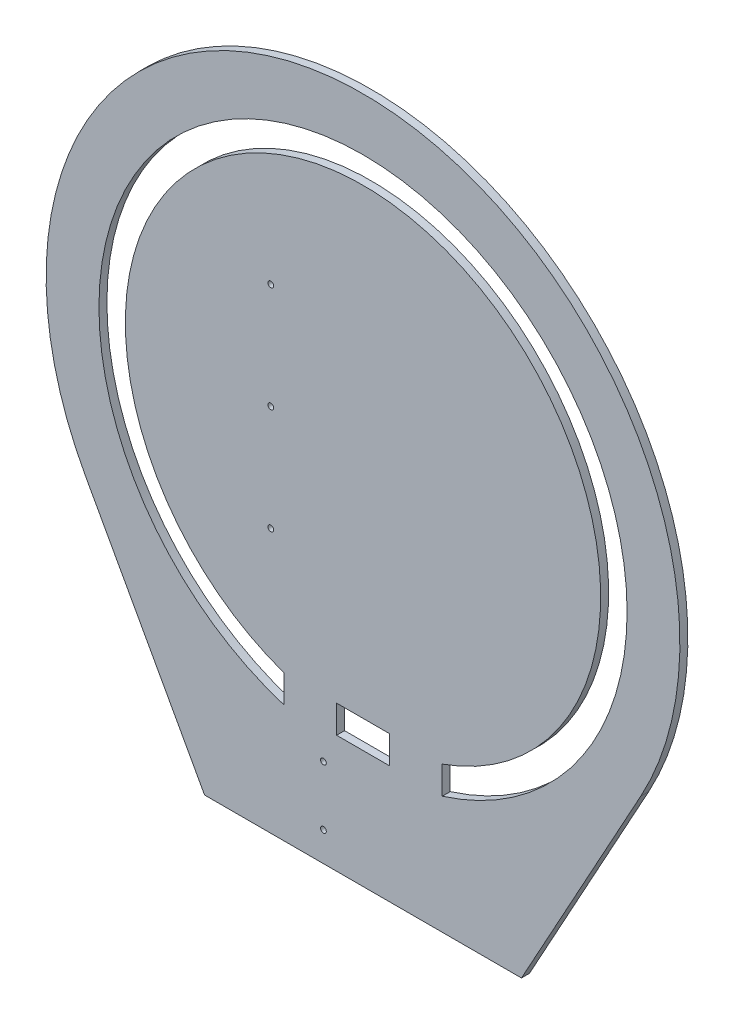
ISO-10303-21;
HEADER;
FILE_DESCRIPTION(('STEP AP214'),'2;1');
FILE_NAME('part.step','',(''),(''),'','','');
FILE_SCHEMA(('AUTOMOTIVE_DESIGN { 1 0 10303 214 1 1 1 1 }'));
ENDSEC;
DATA;
#1=APPLICATION_CONTEXT('core data for automotive mechanical design processes');
#2=APPLICATION_PROTOCOL_DEFINITION('international standard','automotive_design',2000,#1);
#3=PRODUCT_CONTEXT('',#1,'mechanical');
#4=PRODUCT('Part','Part','',(#3));
#5=PRODUCT_RELATED_PRODUCT_CATEGORY('part','',(#4));
#6=PRODUCT_DEFINITION_FORMATION('','',#4);
#7=PRODUCT_DEFINITION_CONTEXT('part definition',#1,'design');
#8=PRODUCT_DEFINITION('design','',#6,#7);
#9=PRODUCT_DEFINITION_SHAPE('','',#8);
#10=(LENGTH_UNIT() NAMED_UNIT(*) SI_UNIT(.MILLI.,.METRE.));
#11=(NAMED_UNIT(*) PLANE_ANGLE_UNIT() SI_UNIT($,.RADIAN.));
#12=(NAMED_UNIT(*) SI_UNIT($,.STERADIAN.) SOLID_ANGLE_UNIT());
#13=UNCERTAINTY_MEASURE_WITH_UNIT(LENGTH_MEASURE(1.E-05),#10,'distance_accuracy_value','');
#14=(GEOMETRIC_REPRESENTATION_CONTEXT(3) GLOBAL_UNCERTAINTY_ASSIGNED_CONTEXT((#13)) GLOBAL_UNIT_ASSIGNED_CONTEXT((#10,
#11,#12)) REPRESENTATION_CONTEXT('',''));
#15=CARTESIAN_POINT('',(0.,0.,0.));
#16=DIRECTION('',(0.,0.,1.));
#17=DIRECTION('',(1.,0.,0.));
#18=AXIS2_PLACEMENT_3D('',#15,#16,#17);
#19=CARTESIAN_POINT('',(26.2928846476366,-14.4459065795843,0.75438));
#20=DIRECTION('',(-0.876429488254551,0.481530219319478,0.));
#21=DIRECTION('',(-0.481530219319478,-0.876429488254552,0.));
#22=AXIS2_PLACEMENT_3D('',#19,#20,#21);
#23=PLANE('',#22);
#24=DIRECTION('',(0.481530219319478,0.876429488254552,0.));
#25=VECTOR('',#24,1.);
#26=CARTESIAN_POINT('',(26.2928846476366,-14.4459065795843,0.));
#27=LINE('',#26,#25);
#28=CARTESIAN_POINT('',(15.,-35.,0.));
#29=VERTEX_POINT('',#28);
#30=CARTESIAN_POINT('',(26.2928846476366,-14.4459065795843,0.));
#31=VERTEX_POINT('',#30);
#32=EDGE_CURVE('E219',#29,#31,#27,.T.);
#33=ORIENTED_EDGE('',*,*,#32,.T.);
#34=DIRECTION('',(0.,0.,-1.));
#35=VECTOR('',#34,1.);
#36=CARTESIAN_POINT('',(26.2928846476366,-14.4459065795843,0.75438));
#37=LINE('',#36,#35);
#38=CARTESIAN_POINT('',(26.2928846476366,-14.4459065795843,0.75438));
#39=VERTEX_POINT('',#38);
#40=EDGE_CURVE('E11',#39,#31,#37,.T.);
#41=ORIENTED_EDGE('',*,*,#40,.F.);
#42=DIRECTION('',(0.481530219319478,0.876429488254552,0.));
#43=VECTOR('',#42,1.);
#44=CARTESIAN_POINT('',(26.2928846476366,-14.4459065795843,0.75438));
#45=LINE('',#44,#43);
#46=CARTESIAN_POINT('',(15.,-35.,0.75438));
#47=VERTEX_POINT('',#46);
#48=EDGE_CURVE('E147',#47,#39,#45,.T.);
#49=ORIENTED_EDGE('',*,*,#48,.F.);
#50=DIRECTION('',(0.,0.,-1.));
#51=VECTOR('',#50,1.);
#52=CARTESIAN_POINT('',(15.,-35.,0.75438));
#53=LINE('',#52,#51);
#54=EDGE_CURVE('E231',#47,#29,#53,.T.);
#55=ORIENTED_EDGE('',*,*,#54,.T.);
#56=EDGE_LOOP('',(#33,#41,#49,#55));
#57=FACE_BOUND('',#56,.T.);
#58=ADVANCED_FACE('F45',(#57),#23,.F.);
#59=CARTESIAN_POINT('',(0.,0.,0.75438));
#60=DIRECTION('',(0.,0.,-1.));
#61=DIRECTION('',(-1.,0.,0.));
#62=AXIS2_PLACEMENT_3D('',#59,#60,#61);
#63=CYLINDRICAL_SURFACE('',#62,30.);
#64=CARTESIAN_POINT('',(0.,0.,0.));
#65=DIRECTION('',(0.,0.,1.));
#66=DIRECTION('',(1.,0.,0.));
#67=AXIS2_PLACEMENT_3D('',#64,#65,#66);
#68=CIRCLE('',#67,30.);
#69=CARTESIAN_POINT('',(-26.2928846476366,-14.4459065795843,0.));
#70=VERTEX_POINT('',#69);
#71=EDGE_CURVE('E154',#31,#70,#68,.T.);
#72=ORIENTED_EDGE('',*,*,#71,.T.);
#73=DIRECTION('',(0.,0.,-1.));
#74=VECTOR('',#73,1.);
#75=CARTESIAN_POINT('',(-26.2928846476366,-14.4459065795843,0.75438));
#76=LINE('',#75,#74);
#77=CARTESIAN_POINT('',(-26.2928846476366,-14.4459065795843,0.75438));
#78=VERTEX_POINT('',#77);
#79=EDGE_CURVE('E56',#78,#70,#76,.T.);
#80=ORIENTED_EDGE('',*,*,#79,.F.);
#81=CARTESIAN_POINT('',(0.,0.,0.75438));
#82=DIRECTION('',(0.,0.,1.));
#83=DIRECTION('',(1.,0.,0.));
#84=AXIS2_PLACEMENT_3D('',#81,#82,#83);
#85=CIRCLE('',#84,30.);
#86=EDGE_CURVE('E141',#39,#78,#85,.T.);
#87=ORIENTED_EDGE('',*,*,#86,.F.);
#88=ORIENTED_EDGE('',*,*,#40,.T.);
#89=EDGE_LOOP('',(#72,#80,#87,#88));
#90=FACE_BOUND('',#89,.T.);
#91=ADVANCED_FACE('F153',(#90),#63,.T.);
#92=CARTESIAN_POINT('',(-26.2928846476366,-14.4459065795843,0.75438));
#93=DIRECTION('',(-0.876429488254552,-0.481530219319478,0.));
#94=DIRECTION('',(0.481530219319478,-0.876429488254552,0.));
#95=AXIS2_PLACEMENT_3D('',#92,#93,#94);
#96=PLANE('',#95);
#97=DIRECTION('',(-0.481530219319478,0.876429488254552,0.));
#98=VECTOR('',#97,1.);
#99=CARTESIAN_POINT('',(-26.2928846476366,-14.4459065795843,0.));
#100=LINE('',#99,#98);
#101=CARTESIAN_POINT('',(-15.,-35.,0.));
#102=VERTEX_POINT('',#101);
#103=EDGE_CURVE('E225',#102,#70,#100,.T.);
#104=ORIENTED_EDGE('',*,*,#103,.F.);
#105=DIRECTION('',(0.,0.,-1.));
#106=VECTOR('',#105,1.);
#107=CARTESIAN_POINT('',(-15.,-35.,0.75438));
#108=LINE('',#107,#106);
#109=CARTESIAN_POINT('',(-15.,-35.,0.75438));
#110=VERTEX_POINT('',#109);
#111=EDGE_CURVE('E105',#110,#102,#108,.T.);
#112=ORIENTED_EDGE('',*,*,#111,.F.);
#113=DIRECTION('',(-0.481530219319478,0.876429488254552,0.));
#114=VECTOR('',#113,1.);
#115=CARTESIAN_POINT('',(-26.2928846476366,-14.4459065795843,0.75438));
#116=LINE('',#115,#114);
#117=EDGE_CURVE('E145',#110,#78,#116,.T.);
#118=ORIENTED_EDGE('',*,*,#117,.T.);
#119=ORIENTED_EDGE('',*,*,#79,.T.);
#120=EDGE_LOOP('',(#104,#112,#118,#119));
#121=FACE_BOUND('',#120,.T.);
#122=ADVANCED_FACE('F160',(#121),#96,.T.);
#123=CARTESIAN_POINT('',(2.5,0.,0.75438));
#124=DIRECTION('',(-1.,0.,0.));
#125=DIRECTION('',(0.,0.,1.));
#126=AXIS2_PLACEMENT_3D('',#123,#124,#125);
#127=PLANE('',#126);
#128=DIRECTION('',(0.,1.,0.));
#129=VECTOR('',#128,1.);
#130=CARTESIAN_POINT('',(2.5,0.,0.));
#131=LINE('',#130,#129);
#132=CARTESIAN_POINT('',(2.5,-23.8484800354236,0.));
#133=VERTEX_POINT('',#132);
#134=CARTESIAN_POINT('',(2.5,-21.2132034355964,0.));
#135=VERTEX_POINT('',#134);
#136=EDGE_CURVE('E203',#133,#135,#131,.T.);
#137=ORIENTED_EDGE('',*,*,#136,.F.);
#138=DIRECTION('',(0.,0.,-1.));
#139=VECTOR('',#138,1.);
#140=CARTESIAN_POINT('',(2.5,-23.8484800354236,0.75438));
#141=LINE('',#140,#139);
#142=CARTESIAN_POINT('',(2.5,-23.8484800354236,0.75438));
#143=VERTEX_POINT('',#142);
#144=EDGE_CURVE('E234',#143,#133,#141,.T.);
#145=ORIENTED_EDGE('',*,*,#144,.F.);
#146=DIRECTION('',(0.,1.,0.));
#147=VECTOR('',#146,1.);
#148=CARTESIAN_POINT('',(2.5,0.,0.75438));
#149=LINE('',#148,#147);
#150=CARTESIAN_POINT('',(2.5,-21.2132034355964,0.75438));
#151=VERTEX_POINT('',#150);
#152=EDGE_CURVE('E304',#143,#151,#149,.T.);
#153=ORIENTED_EDGE('',*,*,#152,.T.);
#154=DIRECTION('',(0.,0.,-1.));
#155=VECTOR('',#154,1.);
#156=CARTESIAN_POINT('',(2.5,-21.2132034355964,0.75438));
#157=LINE('',#156,#155);
#158=EDGE_CURVE('E237',#151,#135,#157,.T.);
#159=ORIENTED_EDGE('',*,*,#158,.T.);
#160=EDGE_LOOP('',(#137,#145,#153,#159));
#161=FACE_BOUND('',#160,.T.);
#162=ADVANCED_FACE('F336',(#161),#127,.T.);
#163=CARTESIAN_POINT('',(0.,-23.8484800354236,0.75438));
#164=DIRECTION('',(0.,1.,0.));
#165=DIRECTION('',(0.,0.,1.));
#166=AXIS2_PLACEMENT_3D('',#163,#164,#165);
#167=PLANE('',#166);
#168=DIRECTION('',(1.,0.,0.));
#169=VECTOR('',#168,1.);
#170=CARTESIAN_POINT('',(0.,-23.8484800354236,0.));
#171=LINE('',#170,#169);
#172=CARTESIAN_POINT('',(-2.5,-23.8484800354236,0.));
#173=VERTEX_POINT('',#172);
#174=EDGE_CURVE('E207',#173,#133,#171,.T.);
#175=ORIENTED_EDGE('',*,*,#174,.F.);
#176=DIRECTION('',(0.,0.,-1.));
#177=VECTOR('',#176,1.);
#178=CARTESIAN_POINT('',(-2.5,-23.8484800354236,0.75438));
#179=LINE('',#178,#177);
#180=CARTESIAN_POINT('',(-2.5,-23.8484800354236,0.75438));
#181=VERTEX_POINT('',#180);
#182=EDGE_CURVE('E243',#181,#173,#179,.T.);
#183=ORIENTED_EDGE('',*,*,#182,.F.);
#184=DIRECTION('',(1.,0.,0.));
#185=VECTOR('',#184,1.);
#186=CARTESIAN_POINT('',(0.,-23.8484800354236,0.75438));
#187=LINE('',#186,#185);
#188=EDGE_CURVE('E308',#181,#143,#187,.T.);
#189=ORIENTED_EDGE('',*,*,#188,.T.);
#190=ORIENTED_EDGE('',*,*,#144,.T.);
#191=EDGE_LOOP('',(#175,#183,#189,#190));
#192=FACE_BOUND('',#191,.T.);
#193=ADVANCED_FACE('F338',(#192),#167,.T.);
#194=CARTESIAN_POINT('',(-2.5,0.,0.75438));
#195=DIRECTION('',(-1.,0.,0.));
#196=DIRECTION('',(0.,0.,1.));
#197=AXIS2_PLACEMENT_3D('',#194,#195,#196);
#198=PLANE('',#197);
#199=DIRECTION('',(0.,1.,0.));
#200=VECTOR('',#199,1.);
#201=CARTESIAN_POINT('',(-2.5,0.,0.));
#202=LINE('',#201,#200);
#203=CARTESIAN_POINT('',(-2.5,-21.2132034355964,0.));
#204=VERTEX_POINT('',#203);
#205=EDGE_CURVE('E211',#173,#204,#202,.T.);
#206=ORIENTED_EDGE('',*,*,#205,.T.);
#207=DIRECTION('',(0.,0.,-1.));
#208=VECTOR('',#207,1.);
#209=CARTESIAN_POINT('',(-2.5,-21.2132034355964,0.75438));
#210=LINE('',#209,#208);
#211=CARTESIAN_POINT('',(-2.5,-21.2132034355964,0.75438));
#212=VERTEX_POINT('',#211);
#213=EDGE_CURVE('E240',#212,#204,#210,.T.);
#214=ORIENTED_EDGE('',*,*,#213,.F.);
#215=DIRECTION('',(0.,1.,0.));
#216=VECTOR('',#215,1.);
#217=CARTESIAN_POINT('',(-2.5,0.,0.75438));
#218=LINE('',#217,#216);
#219=EDGE_CURVE('E312',#181,#212,#218,.T.);
#220=ORIENTED_EDGE('',*,*,#219,.F.);
#221=ORIENTED_EDGE('',*,*,#182,.T.);
#222=EDGE_LOOP('',(#206,#214,#220,#221));
#223=FACE_BOUND('',#222,.T.);
#224=ADVANCED_FACE('F329',(#223),#198,.F.);
#225=CARTESIAN_POINT('',(-7.5,0.,0.75438));
#226=DIRECTION('',(-1.,0.,0.));
#227=DIRECTION('',(0.,0.,1.));
#228=AXIS2_PLACEMENT_3D('',#225,#226,#227);
#229=PLANE('',#228);
#230=DIRECTION('',(0.,1.,0.));
#231=VECTOR('',#230,1.);
#232=CARTESIAN_POINT('',(-7.5,0.,0.));
#233=LINE('',#232,#231);
#234=CARTESIAN_POINT('',(-7.5,-23.8484800354236,0.));
#235=VERTEX_POINT('',#234);
#236=CARTESIAN_POINT('',(-7.5,-21.2132034355964,0.));
#237=VERTEX_POINT('',#236);
#238=EDGE_CURVE('E168',#235,#237,#233,.T.);
#239=ORIENTED_EDGE('',*,*,#238,.F.);
#240=DIRECTION('',(0.,0.,-1.));
#241=VECTOR('',#240,1.);
#242=CARTESIAN_POINT('',(-7.5,-23.8484800354236,0.75438));
#243=LINE('',#242,#241);
#244=CARTESIAN_POINT('',(-7.5,-23.8484800354236,0.75438));
#245=VERTEX_POINT('',#244);
#246=EDGE_CURVE('E49',#245,#235,#243,.T.);
#247=ORIENTED_EDGE('',*,*,#246,.F.);
#248=DIRECTION('',(0.,1.,0.));
#249=VECTOR('',#248,1.);
#250=CARTESIAN_POINT('',(-7.5,0.,0.75438));
#251=LINE('',#250,#249);
#252=CARTESIAN_POINT('',(-7.5,-21.2132034355964,0.75438));
#253=VERTEX_POINT('',#252);
#254=EDGE_CURVE('E230',#245,#253,#251,.T.);
#255=ORIENTED_EDGE('',*,*,#254,.T.);
#256=DIRECTION('',(0.,0.,-1.));
#257=VECTOR('',#256,1.);
#258=CARTESIAN_POINT('',(-7.5,-21.2132034355964,0.75438));
#259=LINE('',#258,#257);
#260=EDGE_CURVE('E164',#253,#237,#259,.T.);
#261=ORIENTED_EDGE('',*,*,#260,.T.);
#262=EDGE_LOOP('',(#239,#247,#255,#261));
#263=FACE_BOUND('',#262,.T.);
#264=ADVANCED_FACE('F47',(#263),#229,.T.);
#265=CARTESIAN_POINT('',(0.,0.,0.75438));
#266=DIRECTION('',(0.,0.,-1.));
#267=DIRECTION('',(-1.,0.,0.));
#268=AXIS2_PLACEMENT_3D('',#265,#266,#267);
#269=CYLINDRICAL_SURFACE('',#268,25.);
#270=CARTESIAN_POINT('',(0.,0.,0.));
#271=DIRECTION('',(0.,0.,1.));
#272=DIRECTION('',(1.,0.,0.));
#273=AXIS2_PLACEMENT_3D('',#270,#271,#272);
#274=CIRCLE('',#273,25.);
#275=CARTESIAN_POINT('',(7.5,-23.8484800354236,0.));
#276=VERTEX_POINT('',#275);
#277=EDGE_CURVE('E172',#276,#235,#274,.T.);
#278=ORIENTED_EDGE('',*,*,#277,.F.);
#279=DIRECTION('',(0.,0.,-1.));
#280=VECTOR('',#279,1.);
#281=CARTESIAN_POINT('',(7.5,-23.8484800354236,0.75438));
#282=LINE('',#281,#280);
#283=CARTESIAN_POINT('',(7.5,-23.8484800354236,0.75438));
#284=VERTEX_POINT('',#283);
#285=EDGE_CURVE('E253',#284,#276,#282,.T.);
#286=ORIENTED_EDGE('',*,*,#285,.F.);
#287=CARTESIAN_POINT('',(0.,0.,0.75438));
#288=DIRECTION('',(0.,0.,1.));
#289=DIRECTION('',(1.,0.,0.));
#290=AXIS2_PLACEMENT_3D('',#287,#288,#289);
#291=CIRCLE('',#290,25.);
#292=EDGE_CURVE('E264',#284,#245,#291,.T.);
#293=ORIENTED_EDGE('',*,*,#292,.T.);
#294=ORIENTED_EDGE('',*,*,#246,.T.);
#295=EDGE_LOOP('',(#278,#286,#293,#294));
#296=FACE_BOUND('',#295,.T.);
#297=ADVANCED_FACE('F262',(#296),#269,.F.);
#298=CARTESIAN_POINT('',(7.5,0.,0.75438));
#299=DIRECTION('',(-1.,0.,0.));
#300=DIRECTION('',(0.,0.,1.));
#301=AXIS2_PLACEMENT_3D('',#298,#299,#300);
#302=PLANE('',#301);
#303=DIRECTION('',(0.,1.,0.));
#304=VECTOR('',#303,1.);
#305=CARTESIAN_POINT('',(7.5,0.,0.));
#306=LINE('',#305,#304);
#307=CARTESIAN_POINT('',(7.5,-21.2132034355964,0.));
#308=VERTEX_POINT('',#307);
#309=EDGE_CURVE('E176',#276,#308,#306,.T.);
#310=ORIENTED_EDGE('',*,*,#309,.T.);
#311=DIRECTION('',(0.,0.,-1.));
#312=VECTOR('',#311,1.);
#313=CARTESIAN_POINT('',(7.5,-21.2132034355964,0.75438));
#314=LINE('',#313,#312);
#315=CARTESIAN_POINT('',(7.5,-21.2132034355964,0.75438));
#316=VERTEX_POINT('',#315);
#317=EDGE_CURVE('E250',#316,#308,#314,.T.);
#318=ORIENTED_EDGE('',*,*,#317,.F.);
#319=DIRECTION('',(0.,1.,0.));
#320=VECTOR('',#319,1.);
#321=CARTESIAN_POINT('',(7.5,0.,0.75438));
#322=LINE('',#321,#320);
#323=EDGE_CURVE('E279',#284,#316,#322,.T.);
#324=ORIENTED_EDGE('',*,*,#323,.F.);
#325=ORIENTED_EDGE('',*,*,#285,.T.);
#326=EDGE_LOOP('',(#310,#318,#324,#325));
#327=FACE_BOUND('',#326,.T.);
#328=ADVANCED_FACE('F271',(#327),#302,.F.);
#329=CARTESIAN_POINT('',(0.,-21.2132034355964,0.75438));
#330=DIRECTION('',(0.,-1.,0.));
#331=DIRECTION('',(0.,0.,-1.));
#332=AXIS2_PLACEMENT_3D('',#329,#330,#331);
#333=PLANE('',#332);
#334=DIRECTION('',(-1.,0.,0.));
#335=VECTOR('',#334,1.);
#336=CARTESIAN_POINT('',(0.,-21.2132034355964,0.));
#337=LINE('',#336,#335);
#338=EDGE_CURVE('E215',#135,#204,#337,.T.);
#339=ORIENTED_EDGE('',*,*,#338,.F.);
#340=ORIENTED_EDGE('',*,*,#158,.F.);
#341=DIRECTION('',(-1.,0.,0.));
#342=VECTOR('',#341,1.);
#343=CARTESIAN_POINT('',(0.,-21.2132034355964,0.75438));
#344=LINE('',#343,#342);
#345=EDGE_CURVE('E315',#151,#212,#344,.T.);
#346=ORIENTED_EDGE('',*,*,#345,.T.);
#347=ORIENTED_EDGE('',*,*,#213,.T.);
#348=EDGE_LOOP('',(#339,#340,#346,#347));
#349=FACE_BOUND('',#348,.T.);
#350=ADVANCED_FACE('F322',(#349),#333,.T.);
#351=CARTESIAN_POINT('',(-3.7500000022113,-26.6242400340328,0.75438));
#352=DIRECTION('',(0.,0.,-1.));
#353=DIRECTION('',(-1.,0.,0.));
#354=AXIS2_PLACEMENT_3D('',#351,#352,#353);
#355=CYLINDRICAL_SURFACE('',#354,0.271779999999999);
#356=CARTESIAN_POINT('',(-3.7500000022113,-26.6242400340328,0.75438));
#357=DIRECTION('',(0.,0.,1.));
#358=DIRECTION('',(1.,0.,0.));
#359=AXIS2_PLACEMENT_3D('',#356,#357,#358);
#360=CIRCLE('',#359,0.271779999999999);
#361=CARTESIAN_POINT('',(-3.4782200022113,-26.6242400340328,0.75438));
#362=VERTEX_POINT('',#361);
#363=EDGE_CURVE('E300',#362,#362,#360,.T.);
#364=ORIENTED_EDGE('',*,*,#363,.T.);
#365=EDGE_LOOP('',(#364));
#366=FACE_BOUND('',#365,.T.);
#367=CARTESIAN_POINT('',(-3.7500000022113,-26.6242400340328,0.));
#368=DIRECTION('',(0.,0.,1.));
#369=DIRECTION('',(1.,0.,0.));
#370=AXIS2_PLACEMENT_3D('',#367,#368,#369);
#371=CIRCLE('',#370,0.271779999999999);
#372=CARTESIAN_POINT('',(-3.4782200022113,-26.6242400340328,0.));
#373=VERTEX_POINT('',#372);
#374=EDGE_CURVE('E199',#373,#373,#371,.T.);
#375=ORIENTED_EDGE('',*,*,#374,.F.);
#376=EDGE_LOOP('',(#375));
#377=FACE_BOUND('',#376,.T.);
#378=ADVANCED_FACE('F357',(#366,#377),#355,.F.);
#379=CARTESIAN_POINT('',(-3.7500000022113,-32.2242400340328,0.75438));
#380=DIRECTION('',(0.,0.,-1.));
#381=DIRECTION('',(-1.,0.,0.));
#382=AXIS2_PLACEMENT_3D('',#379,#380,#381);
#383=CYLINDRICAL_SURFACE('',#382,0.271780000000001);
#384=CARTESIAN_POINT('',(-3.7500000022113,-32.2242400340328,0.75438));
#385=DIRECTION('',(0.,0.,1.));
#386=DIRECTION('',(1.,0.,0.));
#387=AXIS2_PLACEMENT_3D('',#384,#385,#386);
#388=CIRCLE('',#387,0.271780000000001);
#389=CARTESIAN_POINT('',(-3.4782200022113,-32.2242400340328,0.75438));
#390=VERTEX_POINT('',#389);
#391=EDGE_CURVE('E296',#390,#390,#388,.T.);
#392=ORIENTED_EDGE('',*,*,#391,.T.);
#393=EDGE_LOOP('',(#392));
#394=FACE_BOUND('',#393,.T.);
#395=CARTESIAN_POINT('',(-3.7500000022113,-32.2242400340328,0.));
#396=DIRECTION('',(0.,0.,1.));
#397=DIRECTION('',(1.,0.,0.));
#398=AXIS2_PLACEMENT_3D('',#395,#396,#397);
#399=CIRCLE('',#398,0.271780000000001);
#400=CARTESIAN_POINT('',(-3.4782200022113,-32.2242400340328,0.));
#401=VERTEX_POINT('',#400);
#402=EDGE_CURVE('E195',#401,#401,#399,.T.);
#403=ORIENTED_EDGE('',*,*,#402,.F.);
#404=EDGE_LOOP('',(#403));
#405=FACE_BOUND('',#404,.T.);
#406=ADVANCED_FACE('F362',(#394,#405),#383,.F.);
#407=CARTESIAN_POINT('',(-8.73379214847929,-10.,0.75438));
#408=DIRECTION('',(0.,0.,-1.));
#409=DIRECTION('',(-1.,0.,0.));
#410=AXIS2_PLACEMENT_3D('',#407,#408,#409);
#411=CYLINDRICAL_SURFACE('',#410,0.271780000000002);
#412=CARTESIAN_POINT('',(-8.73379214847929,-10.,0.75438));
#413=DIRECTION('',(0.,0.,1.));
#414=DIRECTION('',(1.,0.,0.));
#415=AXIS2_PLACEMENT_3D('',#412,#413,#414);
#416=CIRCLE('',#415,0.271780000000002);
#417=CARTESIAN_POINT('',(-8.46201214847929,-10.,0.75438));
#418=VERTEX_POINT('',#417);
#419=EDGE_CURVE('E292',#418,#418,#416,.T.);
#420=ORIENTED_EDGE('',*,*,#419,.T.);
#421=EDGE_LOOP('',(#420));
#422=FACE_BOUND('',#421,.T.);
#423=CARTESIAN_POINT('',(-8.73379214847929,-10.,0.));
#424=DIRECTION('',(0.,0.,1.));
#425=DIRECTION('',(1.,0.,0.));
#426=AXIS2_PLACEMENT_3D('',#423,#424,#425);
#427=CIRCLE('',#426,0.271780000000002);
#428=CARTESIAN_POINT('',(-8.46201214847929,-10.,0.));
#429=VERTEX_POINT('',#428);
#430=EDGE_CURVE('E191',#429,#429,#427,.T.);
#431=ORIENTED_EDGE('',*,*,#430,.F.);
#432=EDGE_LOOP('',(#431));
#433=FACE_BOUND('',#432,.T.);
#434=ADVANCED_FACE('F380',(#422,#433),#411,.F.);
#435=CARTESIAN_POINT('',(-8.73379214847929,0.,0.75438));
#436=DIRECTION('',(0.,0.,-1.));
#437=DIRECTION('',(-1.,0.,0.));
#438=AXIS2_PLACEMENT_3D('',#435,#436,#437);
#439=CYLINDRICAL_SURFACE('',#438,0.271779999999998);
#440=CARTESIAN_POINT('',(-8.73379214847929,0.,0.75438));
#441=DIRECTION('',(0.,0.,1.));
#442=DIRECTION('',(1.,0.,0.));
#443=AXIS2_PLACEMENT_3D('',#440,#441,#442);
#444=CIRCLE('',#443,0.271779999999998);
#445=CARTESIAN_POINT('',(-8.46201214847929,0.,0.75438));
#446=VERTEX_POINT('',#445);
#447=EDGE_CURVE('E284',#446,#446,#444,.T.);
#448=ORIENTED_EDGE('',*,*,#447,.T.);
#449=EDGE_LOOP('',(#448));
#450=FACE_BOUND('',#449,.T.);
#451=CARTESIAN_POINT('',(-8.73379214847929,0.,0.));
#452=DIRECTION('',(0.,0.,1.));
#453=DIRECTION('',(1.,0.,0.));
#454=AXIS2_PLACEMENT_3D('',#451,#452,#453);
#455=CIRCLE('',#454,0.271779999999998);
#456=CARTESIAN_POINT('',(-8.46201214847929,0.,0.));
#457=VERTEX_POINT('',#456);
#458=EDGE_CURVE('E187',#457,#457,#455,.T.);
#459=ORIENTED_EDGE('',*,*,#458,.F.);
#460=EDGE_LOOP('',(#459));
#461=FACE_BOUND('',#460,.T.);
#462=ADVANCED_FACE('F376',(#450,#461),#439,.F.);
#463=CARTESIAN_POINT('',(-8.73379214847929,10.,0.75438));
#464=DIRECTION('',(0.,0.,-1.));
#465=DIRECTION('',(-1.,0.,0.));
#466=AXIS2_PLACEMENT_3D('',#463,#464,#465);
#467=CYLINDRICAL_SURFACE('',#466,0.27178);
#468=CARTESIAN_POINT('',(-8.73379214847929,10.,0.75438));
#469=DIRECTION('',(0.,0.,1.));
#470=DIRECTION('',(1.,0.,0.));
#471=AXIS2_PLACEMENT_3D('',#468,#469,#470);
#472=CIRCLE('',#471,0.27178);
#473=CARTESIAN_POINT('',(-8.46201214847929,10.,0.75438));
#474=VERTEX_POINT('',#473);
#475=EDGE_CURVE('E278',#474,#474,#472,.T.);
#476=ORIENTED_EDGE('',*,*,#475,.T.);
#477=EDGE_LOOP('',(#476));
#478=FACE_BOUND('',#477,.T.);
#479=CARTESIAN_POINT('',(-8.73379214847929,10.,0.));
#480=DIRECTION('',(0.,0.,1.));
#481=DIRECTION('',(1.,0.,0.));
#482=AXIS2_PLACEMENT_3D('',#479,#480,#481);
#483=CIRCLE('',#482,0.27178);
#484=CARTESIAN_POINT('',(-8.46201214847929,10.,0.));
#485=VERTEX_POINT('',#484);
#486=EDGE_CURVE('E183',#485,#485,#483,.T.);
#487=ORIENTED_EDGE('',*,*,#486,.F.);
#488=EDGE_LOOP('',(#487));
#489=FACE_BOUND('',#488,.T.);
#490=ADVANCED_FACE('F373',(#478,#489),#467,.F.);
#491=CARTESIAN_POINT('',(0.,0.,0.75438));
#492=DIRECTION('',(0.,0.,-1.));
#493=DIRECTION('',(-1.,0.,0.));
#494=AXIS2_PLACEMENT_3D('',#491,#492,#493);
#495=CYLINDRICAL_SURFACE('',#494,22.5);
#496=CARTESIAN_POINT('',(0.,0.,0.));
#497=DIRECTION('',(0.,0.,1.));
#498=DIRECTION('',(1.,0.,0.));
#499=AXIS2_PLACEMENT_3D('',#496,#497,#498);
#500=CIRCLE('',#499,22.5);
#501=EDGE_CURVE('E179',#308,#237,#500,.T.);
#502=ORIENTED_EDGE('',*,*,#501,.T.);
#503=ORIENTED_EDGE('',*,*,#260,.F.);
#504=CARTESIAN_POINT('',(0.,0.,0.75438));
#505=DIRECTION('',(0.,0.,1.));
#506=DIRECTION('',(1.,0.,0.));
#507=AXIS2_PLACEMENT_3D('',#504,#505,#506);
#508=CIRCLE('',#507,22.5);
#509=EDGE_CURVE('E275',#316,#253,#508,.T.);
#510=ORIENTED_EDGE('',*,*,#509,.F.);
#511=ORIENTED_EDGE('',*,*,#317,.T.);
#512=EDGE_LOOP('',(#502,#503,#510,#511));
#513=FACE_BOUND('',#512,.T.);
#514=ADVANCED_FACE('F274',(#513),#495,.T.);
#515=CARTESIAN_POINT('',(0.,-35.,0.75438));
#516=DIRECTION('',(0.,1.,0.));
#517=DIRECTION('',(0.,0.,1.));
#518=AXIS2_PLACEMENT_3D('',#515,#516,#517);
#519=PLANE('',#518);
#520=DIRECTION('',(1.,0.,0.));
#521=VECTOR('',#520,1.);
#522=CARTESIAN_POINT('',(0.,-35.,0.));
#523=LINE('',#522,#521);
#524=EDGE_CURVE('E108',#102,#29,#523,.T.);
#525=ORIENTED_EDGE('',*,*,#524,.T.);
#526=ORIENTED_EDGE('',*,*,#54,.F.);
#527=DIRECTION('',(1.,0.,0.));
#528=VECTOR('',#527,1.);
#529=CARTESIAN_POINT('',(0.,-35.,0.75438));
#530=LINE('',#529,#528);
#531=EDGE_CURVE('E65',#110,#47,#530,.T.);
#532=ORIENTED_EDGE('',*,*,#531,.F.);
#533=ORIENTED_EDGE('',*,*,#111,.T.);
#534=EDGE_LOOP('',(#525,#526,#532,#533));
#535=FACE_BOUND('',#534,.T.);
#536=ADVANCED_FACE('F372',(#535),#519,.F.);
#537=CARTESIAN_POINT('',(0.,0.,0.75438));
#538=DIRECTION('',(0.,0.,1.));
#539=DIRECTION('',(1.,0.,0.));
#540=AXIS2_PLACEMENT_3D('',#537,#538,#539);
#541=PLANE('',#540);
#542=ORIENTED_EDGE('',*,*,#254,.F.);
#543=ORIENTED_EDGE('',*,*,#292,.F.);
#544=ORIENTED_EDGE('',*,*,#323,.T.);
#545=ORIENTED_EDGE('',*,*,#509,.T.);
#546=EDGE_LOOP('',(#542,#543,#544,#545));
#547=FACE_BOUND('',#546,.T.);
#548=ORIENTED_EDGE('',*,*,#475,.F.);
#549=EDGE_LOOP('',(#548));
#550=FACE_BOUND('',#549,.T.);
#551=ORIENTED_EDGE('',*,*,#447,.F.);
#552=EDGE_LOOP('',(#551));
#553=FACE_BOUND('',#552,.T.);
#554=ORIENTED_EDGE('',*,*,#419,.F.);
#555=EDGE_LOOP('',(#554));
#556=FACE_BOUND('',#555,.T.);
#557=ORIENTED_EDGE('',*,*,#391,.F.);
#558=EDGE_LOOP('',(#557));
#559=FACE_BOUND('',#558,.T.);
#560=ORIENTED_EDGE('',*,*,#363,.F.);
#561=EDGE_LOOP('',(#560));
#562=FACE_BOUND('',#561,.T.);
#563=ORIENTED_EDGE('',*,*,#152,.F.);
#564=ORIENTED_EDGE('',*,*,#188,.F.);
#565=ORIENTED_EDGE('',*,*,#219,.T.);
#566=ORIENTED_EDGE('',*,*,#345,.F.);
#567=EDGE_LOOP('',(#563,#564,#565,#566));
#568=FACE_BOUND('',#567,.T.);
#569=ORIENTED_EDGE('',*,*,#48,.T.);
#570=ORIENTED_EDGE('',*,*,#86,.T.);
#571=ORIENTED_EDGE('',*,*,#117,.F.);
#572=ORIENTED_EDGE('',*,*,#531,.T.);
#573=EDGE_LOOP('',(#569,#570,#571,#572));
#574=FACE_BOUND('',#573,.T.);
#575=ADVANCED_FACE('F143',(#547,#550,#553,#556,#559,#562,#568,#574),#541,.T.);
#576=CARTESIAN_POINT('',(0.,0.,0.));
#577=DIRECTION('',(0.,0.,1.));
#578=DIRECTION('',(1.,0.,0.));
#579=AXIS2_PLACEMENT_3D('',#576,#577,#578);
#580=PLANE('',#579);
#581=ORIENTED_EDGE('',*,*,#238,.T.);
#582=ORIENTED_EDGE('',*,*,#501,.F.);
#583=ORIENTED_EDGE('',*,*,#309,.F.);
#584=ORIENTED_EDGE('',*,*,#277,.T.);
#585=EDGE_LOOP('',(#581,#582,#583,#584));
#586=FACE_BOUND('',#585,.T.);
#587=ORIENTED_EDGE('',*,*,#486,.T.);
#588=EDGE_LOOP('',(#587));
#589=FACE_BOUND('',#588,.T.);
#590=ORIENTED_EDGE('',*,*,#458,.T.);
#591=EDGE_LOOP('',(#590));
#592=FACE_BOUND('',#591,.T.);
#593=ORIENTED_EDGE('',*,*,#430,.T.);
#594=EDGE_LOOP('',(#593));
#595=FACE_BOUND('',#594,.T.);
#596=ORIENTED_EDGE('',*,*,#402,.T.);
#597=EDGE_LOOP('',(#596));
#598=FACE_BOUND('',#597,.T.);
#599=ORIENTED_EDGE('',*,*,#374,.T.);
#600=EDGE_LOOP('',(#599));
#601=FACE_BOUND('',#600,.T.);
#602=ORIENTED_EDGE('',*,*,#136,.T.);
#603=ORIENTED_EDGE('',*,*,#338,.T.);
#604=ORIENTED_EDGE('',*,*,#205,.F.);
#605=ORIENTED_EDGE('',*,*,#174,.T.);
#606=EDGE_LOOP('',(#602,#603,#604,#605));
#607=FACE_BOUND('',#606,.T.);
#608=ORIENTED_EDGE('',*,*,#32,.F.);
#609=ORIENTED_EDGE('',*,*,#524,.F.);
#610=ORIENTED_EDGE('',*,*,#103,.T.);
#611=ORIENTED_EDGE('',*,*,#71,.F.);
#612=EDGE_LOOP('',(#608,#609,#610,#611));
#613=FACE_BOUND('',#612,.T.);
#614=ADVANCED_FACE('F268',(#586,#589,#592,#595,#598,#601,#607,#613),#580,.F.);
#615=CLOSED_SHELL('',(#58,#91,#122,#162,#193,#224,#264,#297,#328,#350,#378,#406,#434,#462,#490,
#514,#536,#575,#614));
#616=MANIFOLD_SOLID_BREP('B2',#615);
#617=ADVANCED_BREP_SHAPE_REPRESENTATION('',(#18,#616),#14);
#618=SHAPE_DEFINITION_REPRESENTATION(#9,#617);
ENDSEC;
END-ISO-10303-21;
